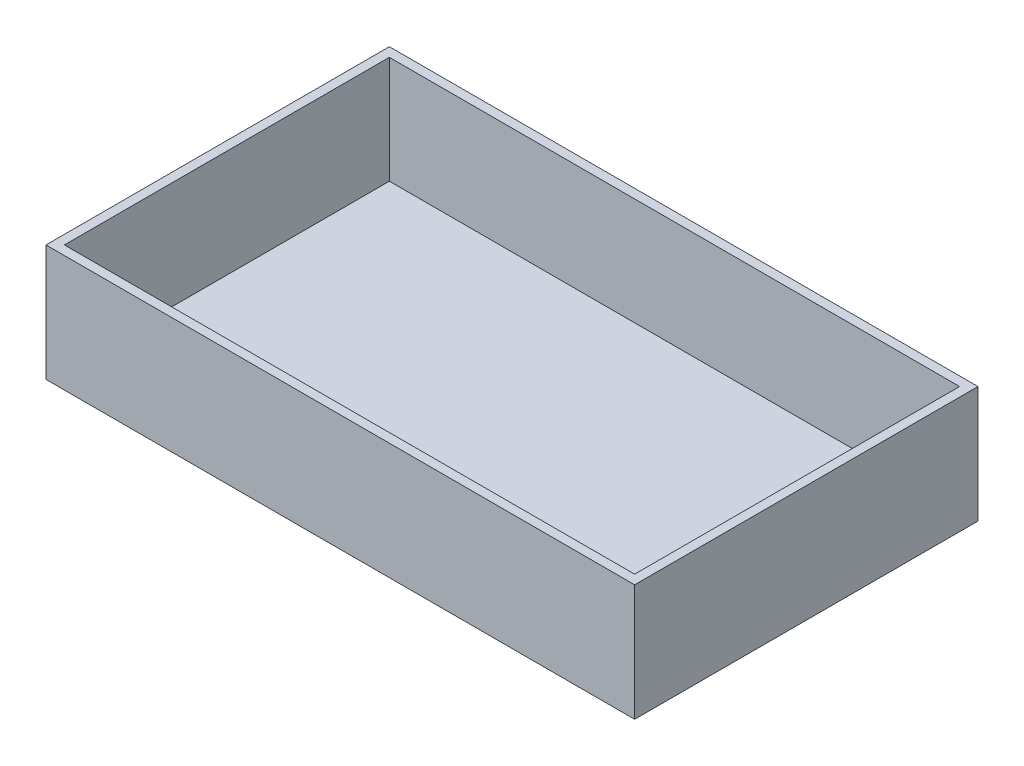
ISO-10303-21;
HEADER;
FILE_DESCRIPTION(('STEP AP214'),'2;1');
FILE_NAME('part.step','',(''),(''),'','','');
FILE_SCHEMA(('AUTOMOTIVE_DESIGN { 1 0 10303 214 1 1 1 1 }'));
ENDSEC;
DATA;
#1=APPLICATION_CONTEXT('core data for automotive mechanical design processes');
#2=APPLICATION_PROTOCOL_DEFINITION('international standard','automotive_design',2000,#1);
#3=PRODUCT_CONTEXT('',#1,'mechanical');
#4=PRODUCT('Part','Part','',(#3));
#5=PRODUCT_RELATED_PRODUCT_CATEGORY('part','',(#4));
#6=PRODUCT_DEFINITION_FORMATION('','',#4);
#7=PRODUCT_DEFINITION_CONTEXT('part definition',#1,'design');
#8=PRODUCT_DEFINITION('design','',#6,#7);
#9=PRODUCT_DEFINITION_SHAPE('','',#8);
#10=(LENGTH_UNIT() NAMED_UNIT(*) SI_UNIT(.MILLI.,.METRE.));
#11=(NAMED_UNIT(*) PLANE_ANGLE_UNIT() SI_UNIT($,.RADIAN.));
#12=(NAMED_UNIT(*) SI_UNIT($,.STERADIAN.) SOLID_ANGLE_UNIT());
#13=UNCERTAINTY_MEASURE_WITH_UNIT(LENGTH_MEASURE(1.E-05),#10,'distance_accuracy_value','');
#14=(GEOMETRIC_REPRESENTATION_CONTEXT(3) GLOBAL_UNCERTAINTY_ASSIGNED_CONTEXT((#13)) GLOBAL_UNIT_ASSIGNED_CONTEXT((#10,
#11,#12)) REPRESENTATION_CONTEXT('',''));
#15=CARTESIAN_POINT('',(0.,0.,0.));
#16=DIRECTION('',(0.,0.,1.));
#17=DIRECTION('',(1.,0.,0.));
#18=AXIS2_PLACEMENT_3D('',#15,#16,#17);
#19=CARTESIAN_POINT('',(0.,19.,0.));
#20=DIRECTION('',(0.,-1.,0.));
#21=DIRECTION('',(0.,0.,-1.));
#22=AXIS2_PLACEMENT_3D('',#19,#20,#21);
#23=PLANE('',#22);
#24=DIRECTION('',(0.,0.,1.));
#25=VECTOR('',#24,1.);
#26=CARTESIAN_POINT('',(-48.,19.,-28.));
#27=LINE('',#26,#25);
#28=CARTESIAN_POINT('',(-48.,19.,-28.));
#29=VERTEX_POINT('',#28);
#30=CARTESIAN_POINT('',(-48.,19.,28.));
#31=VERTEX_POINT('',#30);
#32=EDGE_CURVE('E224',#29,#31,#27,.T.);
#33=ORIENTED_EDGE('',*,*,#32,.T.);
#34=DIRECTION('',(1.,0.,0.));
#35=VECTOR('',#34,1.);
#36=CARTESIAN_POINT('',(48.,19.,28.));
#37=LINE('',#36,#35);
#38=CARTESIAN_POINT('',(48.,19.,28.));
#39=VERTEX_POINT('',#38);
#40=EDGE_CURVE('E228',#31,#39,#37,.T.);
#41=ORIENTED_EDGE('',*,*,#40,.T.);
#42=DIRECTION('',(0.,0.,-1.));
#43=VECTOR('',#42,1.);
#44=CARTESIAN_POINT('',(48.,19.,-28.));
#45=LINE('',#44,#43);
#46=CARTESIAN_POINT('',(48.,19.,-28.));
#47=VERTEX_POINT('',#46);
#48=EDGE_CURVE('E232',#39,#47,#45,.T.);
#49=ORIENTED_EDGE('',*,*,#48,.T.);
#50=DIRECTION('',(-1.,0.,0.));
#51=VECTOR('',#50,1.);
#52=CARTESIAN_POINT('',(48.,19.,-28.));
#53=LINE('',#52,#51);
#54=EDGE_CURVE('E235',#47,#29,#53,.T.);
#55=ORIENTED_EDGE('',*,*,#54,.T.);
#56=EDGE_LOOP('',(#33,#41,#49,#55));
#57=FACE_BOUND('',#56,.T.);
#58=DIRECTION('',(0.,0.,1.));
#59=VECTOR('',#58,1.);
#60=CARTESIAN_POINT('',(-46.5,19.,0.));
#61=LINE('',#60,#59);
#62=CARTESIAN_POINT('',(-46.5,19.,-26.5));
#63=VERTEX_POINT('',#62);
#64=CARTESIAN_POINT('',(-46.5,19.,26.5));
#65=VERTEX_POINT('',#64);
#66=EDGE_CURVE('E212',#63,#65,#61,.T.);
#67=ORIENTED_EDGE('',*,*,#66,.F.);
#68=DIRECTION('',(-1.,0.,0.));
#69=VECTOR('',#68,1.);
#70=CARTESIAN_POINT('',(0.,19.,-26.5));
#71=LINE('',#70,#69);
#72=CARTESIAN_POINT('',(46.5,19.,-26.5));
#73=VERTEX_POINT('',#72);
#74=EDGE_CURVE('E197',#73,#63,#71,.T.);
#75=ORIENTED_EDGE('',*,*,#74,.F.);
#76=DIRECTION('',(0.,0.,-1.));
#77=VECTOR('',#76,1.);
#78=CARTESIAN_POINT('',(46.5,19.,0.));
#79=LINE('',#78,#77);
#80=CARTESIAN_POINT('',(46.5,19.,26.5));
#81=VERTEX_POINT('',#80);
#82=EDGE_CURVE('E218',#81,#73,#79,.T.);
#83=ORIENTED_EDGE('',*,*,#82,.F.);
#84=DIRECTION('',(1.,0.,0.));
#85=VECTOR('',#84,1.);
#86=CARTESIAN_POINT('',(0.,19.,26.5));
#87=LINE('',#86,#85);
#88=EDGE_CURVE('E215',#65,#81,#87,.T.);
#89=ORIENTED_EDGE('',*,*,#88,.F.);
#90=EDGE_LOOP('',(#67,#75,#83,#89));
#91=FACE_BOUND('',#90,.T.);
#92=ADVANCED_FACE('F45',(#57,#91),#23,.F.);
#93=CARTESIAN_POINT('',(-48.,19.,-28.));
#94=DIRECTION('',(1.,0.,0.));
#95=DIRECTION('',(0.,0.,-1.));
#96=AXIS2_PLACEMENT_3D('',#93,#94,#95);
#97=PLANE('',#96);
#98=DIRECTION('',(0.,0.,1.));
#99=VECTOR('',#98,1.);
#100=CARTESIAN_POINT('',(-48.,0.,-28.));
#101=LINE('',#100,#99);
#102=CARTESIAN_POINT('',(-48.,0.,-28.));
#103=VERTEX_POINT('',#102);
#104=CARTESIAN_POINT('',(-48.,0.,28.));
#105=VERTEX_POINT('',#104);
#106=EDGE_CURVE('E190',#103,#105,#101,.T.);
#107=ORIENTED_EDGE('',*,*,#106,.T.);
#108=DIRECTION('',(0.,-1.,0.));
#109=VECTOR('',#108,1.);
#110=CARTESIAN_POINT('',(-48.,19.,28.));
#111=LINE('',#110,#109);
#112=EDGE_CURVE('E11',#31,#105,#111,.T.);
#113=ORIENTED_EDGE('',*,*,#112,.F.);
#114=ORIENTED_EDGE('',*,*,#32,.F.);
#115=DIRECTION('',(0.,-1.,0.));
#116=VECTOR('',#115,1.);
#117=CARTESIAN_POINT('',(-48.,19.,-28.));
#118=LINE('',#117,#116);
#119=EDGE_CURVE('E238',#29,#103,#118,.T.);
#120=ORIENTED_EDGE('',*,*,#119,.T.);
#121=EDGE_LOOP('',(#107,#113,#114,#120));
#122=FACE_BOUND('',#121,.T.);
#123=ADVANCED_FACE('F47',(#122),#97,.F.);
#124=CARTESIAN_POINT('',(48.,19.,28.));
#125=DIRECTION('',(0.,0.,-1.));
#126=DIRECTION('',(-1.,0.,0.));
#127=AXIS2_PLACEMENT_3D('',#124,#125,#126);
#128=PLANE('',#127);
#129=DIRECTION('',(1.,0.,0.));
#130=VECTOR('',#129,1.);
#131=CARTESIAN_POINT('',(48.,0.,28.));
#132=LINE('',#131,#130);
#133=CARTESIAN_POINT('',(48.,0.,28.));
#134=VERTEX_POINT('',#133);
#135=EDGE_CURVE('E242',#105,#134,#132,.T.);
#136=ORIENTED_EDGE('',*,*,#135,.T.);
#137=DIRECTION('',(0.,-1.,0.));
#138=VECTOR('',#137,1.);
#139=CARTESIAN_POINT('',(48.,19.,28.));
#140=LINE('',#139,#138);
#141=EDGE_CURVE('E54',#39,#134,#140,.T.);
#142=ORIENTED_EDGE('',*,*,#141,.F.);
#143=ORIENTED_EDGE('',*,*,#40,.F.);
#144=ORIENTED_EDGE('',*,*,#112,.T.);
#145=EDGE_LOOP('',(#136,#142,#143,#144));
#146=FACE_BOUND('',#145,.T.);
#147=ADVANCED_FACE('F278',(#146),#128,.F.);
#148=CARTESIAN_POINT('',(48.,19.,-28.));
#149=DIRECTION('',(-1.,0.,0.));
#150=DIRECTION('',(0.,0.,1.));
#151=AXIS2_PLACEMENT_3D('',#148,#149,#150);
#152=PLANE('',#151);
#153=DIRECTION('',(0.,0.,-1.));
#154=VECTOR('',#153,1.);
#155=CARTESIAN_POINT('',(48.,0.,-28.));
#156=LINE('',#155,#154);
#157=CARTESIAN_POINT('',(48.,0.,-28.));
#158=VERTEX_POINT('',#157);
#159=EDGE_CURVE('E245',#134,#158,#156,.T.);
#160=ORIENTED_EDGE('',*,*,#159,.T.);
#161=DIRECTION('',(0.,-1.,0.));
#162=VECTOR('',#161,1.);
#163=CARTESIAN_POINT('',(48.,19.,-28.));
#164=LINE('',#163,#162);
#165=EDGE_CURVE('E253',#47,#158,#164,.T.);
#166=ORIENTED_EDGE('',*,*,#165,.F.);
#167=ORIENTED_EDGE('',*,*,#48,.F.);
#168=ORIENTED_EDGE('',*,*,#141,.T.);
#169=EDGE_LOOP('',(#160,#166,#167,#168));
#170=FACE_BOUND('',#169,.T.);
#171=ADVANCED_FACE('F262',(#170),#152,.F.);
#172=CARTESIAN_POINT('',(48.,19.,-28.));
#173=DIRECTION('',(0.,0.,1.));
#174=DIRECTION('',(1.,0.,0.));
#175=AXIS2_PLACEMENT_3D('',#172,#173,#174);
#176=PLANE('',#175);
#177=DIRECTION('',(-1.,0.,0.));
#178=VECTOR('',#177,1.);
#179=CARTESIAN_POINT('',(48.,0.,-28.));
#180=LINE('',#179,#178);
#181=EDGE_CURVE('E229',#158,#103,#180,.T.);
#182=ORIENTED_EDGE('',*,*,#181,.T.);
#183=ORIENTED_EDGE('',*,*,#119,.F.);
#184=ORIENTED_EDGE('',*,*,#54,.F.);
#185=ORIENTED_EDGE('',*,*,#165,.T.);
#186=EDGE_LOOP('',(#182,#183,#184,#185));
#187=FACE_BOUND('',#186,.T.);
#188=ADVANCED_FACE('F271',(#187),#176,.F.);
#189=CARTESIAN_POINT('',(0.,0.,0.));
#190=DIRECTION('',(0.,-1.,0.));
#191=DIRECTION('',(0.,0.,-1.));
#192=AXIS2_PLACEMENT_3D('',#189,#190,#191);
#193=PLANE('',#192);
#194=DIRECTION('',(0.,0.,1.));
#195=VECTOR('',#194,1.);
#196=CARTESIAN_POINT('',(0.999999999999994,0.,0.));
#197=LINE('',#196,#195);
#198=CARTESIAN_POINT('',(0.999999999999994,0.,15.5));
#199=VERTEX_POINT('',#198);
#200=CARTESIAN_POINT('',(0.999999999999994,0.,23.5));
#201=VERTEX_POINT('',#200);
#202=EDGE_CURVE('E178',#199,#201,#197,.T.);
#203=ORIENTED_EDGE('',*,*,#202,.F.);
#204=DIRECTION('',(1.,0.,0.));
#205=VECTOR('',#204,1.);
#206=CARTESIAN_POINT('',(0.,0.,15.5));
#207=LINE('',#206,#205);
#208=CARTESIAN_POINT('',(-34.5,0.,15.5));
#209=VERTEX_POINT('',#208);
#210=EDGE_CURVE('E166',#209,#199,#207,.T.);
#211=ORIENTED_EDGE('',*,*,#210,.F.);
#212=DIRECTION('',(0.,0.,-1.));
#213=VECTOR('',#212,1.);
#214=CARTESIAN_POINT('',(-34.5,0.,0.));
#215=LINE('',#214,#213);
#216=CARTESIAN_POINT('',(-34.5,0.,23.5));
#217=VERTEX_POINT('',#216);
#218=EDGE_CURVE('E141',#217,#209,#215,.T.);
#219=ORIENTED_EDGE('',*,*,#218,.F.);
#220=DIRECTION('',(-1.,0.,0.));
#221=VECTOR('',#220,1.);
#222=CARTESIAN_POINT('',(0.,0.,23.5));
#223=LINE('',#222,#221);
#224=EDGE_CURVE('E175',#201,#217,#223,.T.);
#225=ORIENTED_EDGE('',*,*,#224,.F.);
#226=EDGE_LOOP('',(#203,#211,#219,#225));
#227=FACE_BOUND('',#226,.T.);
#228=ORIENTED_EDGE('',*,*,#106,.F.);
#229=ORIENTED_EDGE('',*,*,#181,.F.);
#230=ORIENTED_EDGE('',*,*,#159,.F.);
#231=ORIENTED_EDGE('',*,*,#135,.F.);
#232=EDGE_LOOP('',(#228,#229,#230,#231));
#233=FACE_BOUND('',#232,.T.);
#234=ADVANCED_FACE('F268',(#227,#233),#193,.T.);
#235=CARTESIAN_POINT('',(-46.5,19.,-28.));
#236=DIRECTION('',(1.,0.,0.));
#237=DIRECTION('',(0.,0.,-1.));
#238=AXIS2_PLACEMENT_3D('',#235,#236,#237);
#239=PLANE('',#238);
#240=DIRECTION('',(0.,0.,1.));
#241=VECTOR('',#240,1.);
#242=CARTESIAN_POINT('',(-46.5,1.5,0.));
#243=LINE('',#242,#241);
#244=CARTESIAN_POINT('',(-46.5,1.5,-26.5));
#245=VERTEX_POINT('',#244);
#246=CARTESIAN_POINT('',(-46.5,1.5,26.5));
#247=VERTEX_POINT('',#246);
#248=EDGE_CURVE('E181',#245,#247,#243,.T.);
#249=ORIENTED_EDGE('',*,*,#248,.F.);
#250=DIRECTION('',(0.,-1.,0.));
#251=VECTOR('',#250,1.);
#252=CARTESIAN_POINT('',(-46.5,19.,-26.5));
#253=LINE('',#252,#251);
#254=EDGE_CURVE('E192',#63,#245,#253,.T.);
#255=ORIENTED_EDGE('',*,*,#254,.F.);
#256=ORIENTED_EDGE('',*,*,#66,.T.);
#257=DIRECTION('',(0.,-1.,0.));
#258=VECTOR('',#257,1.);
#259=CARTESIAN_POINT('',(-46.5,19.,26.5));
#260=LINE('',#259,#258);
#261=EDGE_CURVE('E186',#65,#247,#260,.T.);
#262=ORIENTED_EDGE('',*,*,#261,.T.);
#263=EDGE_LOOP('',(#249,#255,#256,#262));
#264=FACE_BOUND('',#263,.T.);
#265=ADVANCED_FACE('F296',(#264),#239,.T.);
#266=CARTESIAN_POINT('',(48.,19.,26.5));
#267=DIRECTION('',(0.,0.,-1.));
#268=DIRECTION('',(-1.,0.,0.));
#269=AXIS2_PLACEMENT_3D('',#266,#267,#268);
#270=PLANE('',#269);
#271=DIRECTION('',(1.,0.,0.));
#272=VECTOR('',#271,1.);
#273=CARTESIAN_POINT('',(0.,1.5,26.5));
#274=LINE('',#273,#272);
#275=CARTESIAN_POINT('',(46.5,1.5,26.5));
#276=VERTEX_POINT('',#275);
#277=EDGE_CURVE('E185',#247,#276,#274,.T.);
#278=ORIENTED_EDGE('',*,*,#277,.F.);
#279=ORIENTED_EDGE('',*,*,#261,.F.);
#280=ORIENTED_EDGE('',*,*,#88,.T.);
#281=DIRECTION('',(0.,-1.,0.));
#282=VECTOR('',#281,1.);
#283=CARTESIAN_POINT('',(46.5,19.,26.5));
#284=LINE('',#283,#282);
#285=EDGE_CURVE('E191',#81,#276,#284,.T.);
#286=ORIENTED_EDGE('',*,*,#285,.T.);
#287=EDGE_LOOP('',(#278,#279,#280,#286));
#288=FACE_BOUND('',#287,.T.);
#289=ADVANCED_FACE('F333',(#288),#270,.T.);
#290=CARTESIAN_POINT('',(46.5,19.,-28.));
#291=DIRECTION('',(-1.,0.,0.));
#292=DIRECTION('',(0.,0.,1.));
#293=AXIS2_PLACEMENT_3D('',#290,#291,#292);
#294=PLANE('',#293);
#295=DIRECTION('',(0.,0.,-1.));
#296=VECTOR('',#295,1.);
#297=CARTESIAN_POINT('',(46.5,1.5,0.));
#298=LINE('',#297,#296);
#299=CARTESIAN_POINT('',(46.5,1.5,-26.5));
#300=VERTEX_POINT('',#299);
#301=EDGE_CURVE('E200',#276,#300,#298,.T.);
#302=ORIENTED_EDGE('',*,*,#301,.F.);
#303=ORIENTED_EDGE('',*,*,#285,.F.);
#304=ORIENTED_EDGE('',*,*,#82,.T.);
#305=DIRECTION('',(0.,-1.,0.));
#306=VECTOR('',#305,1.);
#307=CARTESIAN_POINT('',(46.5,19.,-26.5));
#308=LINE('',#307,#306);
#309=EDGE_CURVE('E196',#73,#300,#308,.T.);
#310=ORIENTED_EDGE('',*,*,#309,.T.);
#311=EDGE_LOOP('',(#302,#303,#304,#310));
#312=FACE_BOUND('',#311,.T.);
#313=ADVANCED_FACE('F342',(#312),#294,.T.);
#314=CARTESIAN_POINT('',(48.,19.,-26.5));
#315=DIRECTION('',(0.,0.,1.));
#316=DIRECTION('',(1.,0.,0.));
#317=AXIS2_PLACEMENT_3D('',#314,#315,#316);
#318=PLANE('',#317);
#319=DIRECTION('',(-1.,0.,0.));
#320=VECTOR('',#319,1.);
#321=CARTESIAN_POINT('',(0.,1.5,-26.5));
#322=LINE('',#321,#320);
#323=EDGE_CURVE('E206',#300,#245,#322,.T.);
#324=ORIENTED_EDGE('',*,*,#323,.F.);
#325=ORIENTED_EDGE('',*,*,#309,.F.);
#326=ORIENTED_EDGE('',*,*,#74,.T.);
#327=ORIENTED_EDGE('',*,*,#254,.T.);
#328=EDGE_LOOP('',(#324,#325,#326,#327));
#329=FACE_BOUND('',#328,.T.);
#330=ADVANCED_FACE('F351',(#329),#318,.T.);
#331=CARTESIAN_POINT('',(0.,1.5,0.));
#332=DIRECTION('',(0.,-1.,0.));
#333=DIRECTION('',(0.,0.,-1.));
#334=AXIS2_PLACEMENT_3D('',#331,#332,#333);
#335=PLANE('',#334);
#336=DIRECTION('',(-1.,0.,0.));
#337=VECTOR('',#336,1.);
#338=CARTESIAN_POINT('',(0.999999999999994,1.5,15.5));
#339=LINE('',#338,#337);
#340=CARTESIAN_POINT('',(0.999999999999994,1.5,15.5));
#341=VERTEX_POINT('',#340);
#342=CARTESIAN_POINT('',(-34.5,1.5,15.5));
#343=VERTEX_POINT('',#342);
#344=EDGE_CURVE('E148',#341,#343,#339,.T.);
#345=ORIENTED_EDGE('',*,*,#344,.F.);
#346=DIRECTION('',(0.,0.,-1.));
#347=VECTOR('',#346,1.);
#348=CARTESIAN_POINT('',(0.999999999999994,1.5,23.5));
#349=LINE('',#348,#347);
#350=CARTESIAN_POINT('',(0.999999999999994,1.5,23.5));
#351=VERTEX_POINT('',#350);
#352=EDGE_CURVE('E69',#351,#341,#349,.T.);
#353=ORIENTED_EDGE('',*,*,#352,.F.);
#354=DIRECTION('',(1.,0.,0.));
#355=VECTOR('',#354,1.);
#356=CARTESIAN_POINT('',(0.999999999999994,1.5,23.5));
#357=LINE('',#356,#355);
#358=CARTESIAN_POINT('',(-34.5,1.5,23.5));
#359=VERTEX_POINT('',#358);
#360=EDGE_CURVE('E156',#359,#351,#357,.T.);
#361=ORIENTED_EDGE('',*,*,#360,.F.);
#362=DIRECTION('',(0.,0.,1.));
#363=VECTOR('',#362,1.);
#364=CARTESIAN_POINT('',(-34.5,1.5,23.5));
#365=LINE('',#364,#363);
#366=EDGE_CURVE('E138',#343,#359,#365,.T.);
#367=ORIENTED_EDGE('',*,*,#366,.F.);
#368=EDGE_LOOP('',(#345,#353,#361,#367));
#369=FACE_BOUND('',#368,.T.);
#370=ORIENTED_EDGE('',*,*,#248,.T.);
#371=ORIENTED_EDGE('',*,*,#277,.T.);
#372=ORIENTED_EDGE('',*,*,#301,.T.);
#373=ORIENTED_EDGE('',*,*,#323,.T.);
#374=EDGE_LOOP('',(#370,#371,#372,#373));
#375=FACE_BOUND('',#374,.T.);
#376=ADVANCED_FACE('F153',(#369,#375),#335,.F.);
#377=CARTESIAN_POINT('',(0.999999999999994,-17.5,23.5));
#378=DIRECTION('',(1.,0.,0.));
#379=DIRECTION('',(0.,0.,-1.));
#380=AXIS2_PLACEMENT_3D('',#377,#378,#379);
#381=PLANE('',#380);
#382=ORIENTED_EDGE('',*,*,#202,.T.);
#383=DIRECTION('',(0.,1.,0.));
#384=VECTOR('',#383,1.);
#385=CARTESIAN_POINT('',(0.999999999999994,-17.5,23.5));
#386=LINE('',#385,#384);
#387=EDGE_CURVE('E163',#201,#351,#386,.T.);
#388=ORIENTED_EDGE('',*,*,#387,.T.);
#389=ORIENTED_EDGE('',*,*,#352,.T.);
#390=DIRECTION('',(0.,1.,0.));
#391=VECTOR('',#390,1.);
#392=CARTESIAN_POINT('',(0.999999999999994,-17.5,15.5));
#393=LINE('',#392,#391);
#394=EDGE_CURVE('E145',#199,#341,#393,.T.);
#395=ORIENTED_EDGE('',*,*,#394,.F.);
#396=EDGE_LOOP('',(#382,#388,#389,#395));
#397=FACE_BOUND('',#396,.T.);
#398=ADVANCED_FACE('F367',(#397),#381,.F.);
#399=CARTESIAN_POINT('',(0.999999999999994,-17.5,23.5));
#400=DIRECTION('',(0.,0.,1.));
#401=DIRECTION('',(1.,0.,0.));
#402=AXIS2_PLACEMENT_3D('',#399,#400,#401);
#403=PLANE('',#402);
#404=ORIENTED_EDGE('',*,*,#224,.T.);
#405=DIRECTION('',(0.,1.,0.));
#406=VECTOR('',#405,1.);
#407=CARTESIAN_POINT('',(-34.5,-17.5,23.5));
#408=LINE('',#407,#406);
#409=EDGE_CURVE('E144',#217,#359,#408,.T.);
#410=ORIENTED_EDGE('',*,*,#409,.T.);
#411=ORIENTED_EDGE('',*,*,#360,.T.);
#412=ORIENTED_EDGE('',*,*,#387,.F.);
#413=EDGE_LOOP('',(#404,#410,#411,#412));
#414=FACE_BOUND('',#413,.T.);
#415=ADVANCED_FACE('F374',(#414),#403,.F.);
#416=CARTESIAN_POINT('',(-34.5,-17.5,23.5));
#417=DIRECTION('',(-1.,0.,0.));
#418=DIRECTION('',(0.,0.,1.));
#419=AXIS2_PLACEMENT_3D('',#416,#417,#418);
#420=PLANE('',#419);
#421=ORIENTED_EDGE('',*,*,#218,.T.);
#422=DIRECTION('',(0.,1.,0.));
#423=VECTOR('',#422,1.);
#424=CARTESIAN_POINT('',(-34.5,-17.5,15.5));
#425=LINE('',#424,#423);
#426=EDGE_CURVE('E61',#209,#343,#425,.T.);
#427=ORIENTED_EDGE('',*,*,#426,.T.);
#428=ORIENTED_EDGE('',*,*,#366,.T.);
#429=ORIENTED_EDGE('',*,*,#409,.F.);
#430=EDGE_LOOP('',(#421,#427,#428,#429));
#431=FACE_BOUND('',#430,.T.);
#432=ADVANCED_FACE('F135',(#431),#420,.F.);
#433=CARTESIAN_POINT('',(0.999999999999994,-17.5,15.5));
#434=DIRECTION('',(0.,0.,-1.));
#435=DIRECTION('',(-1.,0.,0.));
#436=AXIS2_PLACEMENT_3D('',#433,#434,#435);
#437=PLANE('',#436);
#438=ORIENTED_EDGE('',*,*,#210,.T.);
#439=ORIENTED_EDGE('',*,*,#394,.T.);
#440=ORIENTED_EDGE('',*,*,#344,.T.);
#441=ORIENTED_EDGE('',*,*,#426,.F.);
#442=EDGE_LOOP('',(#438,#439,#440,#441));
#443=FACE_BOUND('',#442,.T.);
#444=ADVANCED_FACE('F149',(#443),#437,.F.);
#445=CLOSED_SHELL('',(#92,#123,#147,#171,#188,#234,#265,#289,#313,#330,#376,#398,#415,#432,#444));
#446=MANIFOLD_SOLID_BREP('B2',#445);
#447=ADVANCED_BREP_SHAPE_REPRESENTATION('',(#18,#446),#14);
#448=SHAPE_DEFINITION_REPRESENTATION(#9,#447);
ENDSEC;
END-ISO-10303-21;
